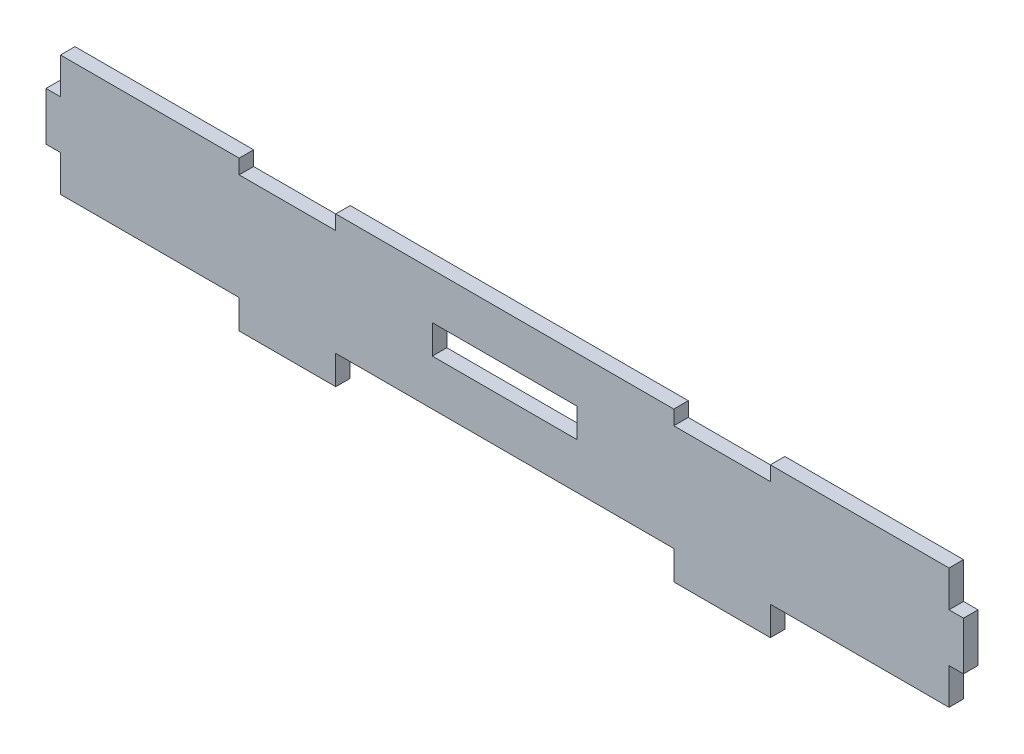
ISO-10303-21;
HEADER;
FILE_DESCRIPTION(('STEP AP214'),'2;1');
FILE_NAME('part.step','',(''),(''),'','','');
FILE_SCHEMA(('AUTOMOTIVE_DESIGN { 1 0 10303 214 1 1 1 1 }'));
ENDSEC;
DATA;
#1=APPLICATION_CONTEXT('core data for automotive mechanical design processes');
#2=APPLICATION_PROTOCOL_DEFINITION('international standard','automotive_design',2000,#1);
#3=PRODUCT_CONTEXT('',#1,'mechanical');
#4=PRODUCT('Part','Part','',(#3));
#5=PRODUCT_RELATED_PRODUCT_CATEGORY('part','',(#4));
#6=PRODUCT_DEFINITION_FORMATION('','',#4);
#7=PRODUCT_DEFINITION_CONTEXT('part definition',#1,'design');
#8=PRODUCT_DEFINITION('design','',#6,#7);
#9=PRODUCT_DEFINITION_SHAPE('','',#8);
#10=(LENGTH_UNIT() NAMED_UNIT(*) SI_UNIT(.MILLI.,.METRE.));
#11=(NAMED_UNIT(*) PLANE_ANGLE_UNIT() SI_UNIT($,.RADIAN.));
#12=(NAMED_UNIT(*) SI_UNIT($,.STERADIAN.) SOLID_ANGLE_UNIT());
#13=UNCERTAINTY_MEASURE_WITH_UNIT(LENGTH_MEASURE(1.E-05),#10,'distance_accuracy_value','');
#14=(GEOMETRIC_REPRESENTATION_CONTEXT(3) GLOBAL_UNCERTAINTY_ASSIGNED_CONTEXT((#13)) GLOBAL_UNIT_ASSIGNED_CONTEXT((#10,
#11,#12)) REPRESENTATION_CONTEXT('',''));
#15=CARTESIAN_POINT('',(0.,0.,0.));
#16=DIRECTION('',(0.,0.,1.));
#17=DIRECTION('',(1.,0.,0.));
#18=AXIS2_PLACEMENT_3D('',#15,#16,#17);
#19=CARTESIAN_POINT('',(0.,0.,3.));
#20=DIRECTION('',(0.,0.,-1.));
#21=DIRECTION('',(-1.,0.,0.));
#22=AXIS2_PLACEMENT_3D('',#19,#20,#21);
#23=PLANE('',#22);
#24=DIRECTION('',(0.,-1.,0.));
#25=VECTOR('',#24,1.);
#26=CARTESIAN_POINT('',(0.,0.,3.));
#27=LINE('',#26,#25);
#28=CARTESIAN_POINT('',(0.,7.5,3.));
#29=VERTEX_POINT('',#28);
#30=CARTESIAN_POINT('',(0.,0.,3.));
#31=VERTEX_POINT('',#30);
#32=EDGE_CURVE('E297',#29,#31,#27,.T.);
#33=ORIENTED_EDGE('',*,*,#32,.T.);
#34=DIRECTION('',(1.,0.,0.));
#35=VECTOR('',#34,1.);
#36=CARTESIAN_POINT('',(0.,0.,3.));
#37=LINE('',#36,#35);
#38=CARTESIAN_POINT('',(37.,0.,3.));
#39=VERTEX_POINT('',#38);
#40=EDGE_CURVE('E301',#31,#39,#37,.T.);
#41=ORIENTED_EDGE('',*,*,#40,.T.);
#42=DIRECTION('',(0.,-1.,0.));
#43=VECTOR('',#42,1.);
#44=CARTESIAN_POINT('',(37.,0.,3.));
#45=LINE('',#44,#43);
#46=CARTESIAN_POINT('',(37.,-6.,3.));
#47=VERTEX_POINT('',#46);
#48=EDGE_CURVE('E305',#39,#47,#45,.T.);
#49=ORIENTED_EDGE('',*,*,#48,.T.);
#50=DIRECTION('',(1.,0.,0.));
#51=VECTOR('',#50,1.);
#52=CARTESIAN_POINT('',(37.,-6.,3.));
#53=LINE('',#52,#51);
#54=CARTESIAN_POINT('',(57.,-6.,3.));
#55=VERTEX_POINT('',#54);
#56=EDGE_CURVE('E308',#47,#55,#53,.T.);
#57=ORIENTED_EDGE('',*,*,#56,.T.);
#58=DIRECTION('',(0.,1.,0.));
#59=VECTOR('',#58,1.);
#60=CARTESIAN_POINT('',(57.,0.,3.));
#61=LINE('',#60,#59);
#62=CARTESIAN_POINT('',(57.,0.,3.));
#63=VERTEX_POINT('',#62);
#64=EDGE_CURVE('E311',#55,#63,#61,.T.);
#65=ORIENTED_EDGE('',*,*,#64,.T.);
#66=DIRECTION('',(1.,0.,0.));
#67=VECTOR('',#66,1.);
#68=CARTESIAN_POINT('',(57.,0.,3.));
#69=LINE('',#68,#67);
#70=CARTESIAN_POINT('',(127.,0.,3.));
#71=VERTEX_POINT('',#70);
#72=EDGE_CURVE('E314',#63,#71,#69,.T.);
#73=ORIENTED_EDGE('',*,*,#72,.T.);
#74=DIRECTION('',(0.,-1.,0.));
#75=VECTOR('',#74,1.);
#76=CARTESIAN_POINT('',(127.,0.,3.));
#77=LINE('',#76,#75);
#78=CARTESIAN_POINT('',(127.,-6.,3.));
#79=VERTEX_POINT('',#78);
#80=EDGE_CURVE('E317',#71,#79,#77,.T.);
#81=ORIENTED_EDGE('',*,*,#80,.T.);
#82=DIRECTION('',(1.,0.,0.));
#83=VECTOR('',#82,1.);
#84=CARTESIAN_POINT('',(127.,-6.,3.));
#85=LINE('',#84,#83);
#86=CARTESIAN_POINT('',(147.,-6.,3.));
#87=VERTEX_POINT('',#86);
#88=EDGE_CURVE('E320',#79,#87,#85,.T.);
#89=ORIENTED_EDGE('',*,*,#88,.T.);
#90=DIRECTION('',(0.,1.,0.));
#91=VECTOR('',#90,1.);
#92=CARTESIAN_POINT('',(147.,0.,3.));
#93=LINE('',#92,#91);
#94=CARTESIAN_POINT('',(147.,0.,3.));
#95=VERTEX_POINT('',#94);
#96=EDGE_CURVE('E323',#87,#95,#93,.T.);
#97=ORIENTED_EDGE('',*,*,#96,.T.);
#98=DIRECTION('',(1.,0.,0.));
#99=VECTOR('',#98,1.);
#100=CARTESIAN_POINT('',(147.,0.,3.));
#101=LINE('',#100,#99);
#102=CARTESIAN_POINT('',(184.,0.,3.));
#103=VERTEX_POINT('',#102);
#104=EDGE_CURVE('E326',#95,#103,#101,.T.);
#105=ORIENTED_EDGE('',*,*,#104,.T.);
#106=DIRECTION('',(0.,1.,0.));
#107=VECTOR('',#106,1.);
#108=CARTESIAN_POINT('',(184.,0.,3.));
#109=LINE('',#108,#107);
#110=CARTESIAN_POINT('',(184.,7.5,3.));
#111=VERTEX_POINT('',#110);
#112=EDGE_CURVE('E329',#103,#111,#109,.T.);
#113=ORIENTED_EDGE('',*,*,#112,.T.);
#114=DIRECTION('',(1.,0.,0.));
#115=VECTOR('',#114,1.);
#116=CARTESIAN_POINT('',(184.,7.5,3.));
#117=LINE('',#116,#115);
#118=CARTESIAN_POINT('',(187.,7.5,3.));
#119=VERTEX_POINT('',#118);
#120=EDGE_CURVE('E332',#111,#119,#117,.T.);
#121=ORIENTED_EDGE('',*,*,#120,.T.);
#122=DIRECTION('',(0.,1.,0.));
#123=VECTOR('',#122,1.);
#124=CARTESIAN_POINT('',(187.,17.5,3.));
#125=LINE('',#124,#123);
#126=CARTESIAN_POINT('',(187.,17.5,3.));
#127=VERTEX_POINT('',#126);
#128=EDGE_CURVE('E335',#119,#127,#125,.T.);
#129=ORIENTED_EDGE('',*,*,#128,.T.);
#130=DIRECTION('',(-1.,0.,0.));
#131=VECTOR('',#130,1.);
#132=CARTESIAN_POINT('',(184.,17.5,3.));
#133=LINE('',#132,#131);
#134=CARTESIAN_POINT('',(184.,17.5,3.));
#135=VERTEX_POINT('',#134);
#136=EDGE_CURVE('E338',#127,#135,#133,.T.);
#137=ORIENTED_EDGE('',*,*,#136,.T.);
#138=DIRECTION('',(0.,1.,0.));
#139=VECTOR('',#138,1.);
#140=CARTESIAN_POINT('',(184.,17.5,3.));
#141=LINE('',#140,#139);
#142=CARTESIAN_POINT('',(184.,25.,3.));
#143=VERTEX_POINT('',#142);
#144=EDGE_CURVE('E341',#135,#143,#141,.T.);
#145=ORIENTED_EDGE('',*,*,#144,.T.);
#146=DIRECTION('',(-1.,0.,0.));
#147=VECTOR('',#146,1.);
#148=CARTESIAN_POINT('',(147.,25.,3.));
#149=LINE('',#148,#147);
#150=CARTESIAN_POINT('',(147.,25.,3.));
#151=VERTEX_POINT('',#150);
#152=EDGE_CURVE('E344',#143,#151,#149,.T.);
#153=ORIENTED_EDGE('',*,*,#152,.T.);
#154=DIRECTION('',(0.,-1.,0.));
#155=VECTOR('',#154,1.);
#156=CARTESIAN_POINT('',(147.,25.,3.));
#157=LINE('',#156,#155);
#158=CARTESIAN_POINT('',(147.,22.,3.));
#159=VERTEX_POINT('',#158);
#160=EDGE_CURVE('E347',#151,#159,#157,.T.);
#161=ORIENTED_EDGE('',*,*,#160,.T.);
#162=DIRECTION('',(-1.,0.,0.));
#163=VECTOR('',#162,1.);
#164=CARTESIAN_POINT('',(127.,22.,3.));
#165=LINE('',#164,#163);
#166=CARTESIAN_POINT('',(127.,22.,3.));
#167=VERTEX_POINT('',#166);
#168=EDGE_CURVE('E350',#159,#167,#165,.T.);
#169=ORIENTED_EDGE('',*,*,#168,.T.);
#170=DIRECTION('',(0.,1.,0.));
#171=VECTOR('',#170,1.);
#172=CARTESIAN_POINT('',(127.,25.,3.));
#173=LINE('',#172,#171);
#174=CARTESIAN_POINT('',(127.,25.,3.));
#175=VERTEX_POINT('',#174);
#176=EDGE_CURVE('E353',#167,#175,#173,.T.);
#177=ORIENTED_EDGE('',*,*,#176,.T.);
#178=DIRECTION('',(-1.,0.,0.));
#179=VECTOR('',#178,1.);
#180=CARTESIAN_POINT('',(57.,25.,3.));
#181=LINE('',#180,#179);
#182=CARTESIAN_POINT('',(57.,25.,3.));
#183=VERTEX_POINT('',#182);
#184=EDGE_CURVE('E356',#175,#183,#181,.T.);
#185=ORIENTED_EDGE('',*,*,#184,.T.);
#186=DIRECTION('',(0.,-1.,0.));
#187=VECTOR('',#186,1.);
#188=CARTESIAN_POINT('',(57.,25.,3.));
#189=LINE('',#188,#187);
#190=CARTESIAN_POINT('',(57.,22.,3.));
#191=VERTEX_POINT('',#190);
#192=EDGE_CURVE('E359',#183,#191,#189,.T.);
#193=ORIENTED_EDGE('',*,*,#192,.T.);
#194=DIRECTION('',(-1.,0.,0.));
#195=VECTOR('',#194,1.);
#196=CARTESIAN_POINT('',(37.,22.,3.));
#197=LINE('',#196,#195);
#198=CARTESIAN_POINT('',(37.,22.,3.));
#199=VERTEX_POINT('',#198);
#200=EDGE_CURVE('E362',#191,#199,#197,.T.);
#201=ORIENTED_EDGE('',*,*,#200,.T.);
#202=DIRECTION('',(0.,1.,0.));
#203=VECTOR('',#202,1.);
#204=CARTESIAN_POINT('',(37.,25.,3.));
#205=LINE('',#204,#203);
#206=CARTESIAN_POINT('',(37.,25.,3.));
#207=VERTEX_POINT('',#206);
#208=EDGE_CURVE('E365',#199,#207,#205,.T.);
#209=ORIENTED_EDGE('',*,*,#208,.T.);
#210=DIRECTION('',(-1.,0.,0.));
#211=VECTOR('',#210,1.);
#212=CARTESIAN_POINT('',(0.,25.,3.));
#213=LINE('',#212,#211);
#214=CARTESIAN_POINT('',(0.,25.,3.));
#215=VERTEX_POINT('',#214);
#216=EDGE_CURVE('E368',#207,#215,#213,.T.);
#217=ORIENTED_EDGE('',*,*,#216,.T.);
#218=DIRECTION('',(0.,-1.,0.));
#219=VECTOR('',#218,1.);
#220=CARTESIAN_POINT('',(0.,17.5,3.));
#221=LINE('',#220,#219);
#222=CARTESIAN_POINT('',(0.,17.5,3.));
#223=VERTEX_POINT('',#222);
#224=EDGE_CURVE('E371',#215,#223,#221,.T.);
#225=ORIENTED_EDGE('',*,*,#224,.T.);
#226=DIRECTION('',(-1.,0.,0.));
#227=VECTOR('',#226,1.);
#228=CARTESIAN_POINT('',(-3.,17.5,3.));
#229=LINE('',#228,#227);
#230=CARTESIAN_POINT('',(-3.,17.5,3.));
#231=VERTEX_POINT('',#230);
#232=EDGE_CURVE('E374',#223,#231,#229,.T.);
#233=ORIENTED_EDGE('',*,*,#232,.T.);
#234=DIRECTION('',(0.,-1.,0.));
#235=VECTOR('',#234,1.);
#236=CARTESIAN_POINT('',(-3.,17.5,3.));
#237=LINE('',#236,#235);
#238=CARTESIAN_POINT('',(-3.,7.5,3.));
#239=VERTEX_POINT('',#238);
#240=EDGE_CURVE('E377',#231,#239,#237,.T.);
#241=ORIENTED_EDGE('',*,*,#240,.T.);
#242=DIRECTION('',(1.,0.,0.));
#243=VECTOR('',#242,1.);
#244=CARTESIAN_POINT('',(-3.,7.5,3.));
#245=LINE('',#244,#243);
#246=EDGE_CURVE('E380',#239,#29,#245,.T.);
#247=ORIENTED_EDGE('',*,*,#246,.T.);
#248=EDGE_LOOP('',(#33,#41,#49,#57,#65,#73,#81,#89,#97,#105,#113,#121,#129,#137,#145,#153,#161,
#169,#177,#185,#193,#201,#209,#217,#225,#233,#241,#247));
#249=FACE_BOUND('',#248,.T.);
#250=DIRECTION('',(0.,-1.,0.));
#251=VECTOR('',#250,1.);
#252=CARTESIAN_POINT('',(77.,15.5,3.));
#253=LINE('',#252,#251);
#254=CARTESIAN_POINT('',(77.,15.5,3.));
#255=VERTEX_POINT('',#254);
#256=CARTESIAN_POINT('',(77.,9.5,3.));
#257=VERTEX_POINT('',#256);
#258=EDGE_CURVE('E249',#255,#257,#253,.T.);
#259=ORIENTED_EDGE('',*,*,#258,.F.);
#260=DIRECTION('',(-1.,0.,0.));
#261=VECTOR('',#260,1.);
#262=CARTESIAN_POINT('',(77.,15.5,3.));
#263=LINE('',#262,#261);
#264=CARTESIAN_POINT('',(107.,15.5,3.));
#265=VERTEX_POINT('',#264);
#266=EDGE_CURVE('E275',#265,#255,#263,.T.);
#267=ORIENTED_EDGE('',*,*,#266,.F.);
#268=DIRECTION('',(0.,1.,0.));
#269=VECTOR('',#268,1.);
#270=CARTESIAN_POINT('',(107.,15.5,3.));
#271=LINE('',#270,#269);
#272=CARTESIAN_POINT('',(107.,9.5,3.));
#273=VERTEX_POINT('',#272);
#274=EDGE_CURVE('E271',#273,#265,#271,.T.);
#275=ORIENTED_EDGE('',*,*,#274,.F.);
#276=DIRECTION('',(1.,0.,0.));
#277=VECTOR('',#276,1.);
#278=CARTESIAN_POINT('',(77.,9.5,3.));
#279=LINE('',#278,#277);
#280=EDGE_CURVE('E258',#257,#273,#279,.T.);
#281=ORIENTED_EDGE('',*,*,#280,.F.);
#282=EDGE_LOOP('',(#259,#267,#275,#281));
#283=FACE_BOUND('',#282,.T.);
#284=ADVANCED_FACE('F39',(#249,#283),#23,.F.);
#285=CARTESIAN_POINT('',(0.,0.,0.));
#286=DIRECTION('',(0.,0.,-1.));
#287=DIRECTION('',(-1.,0.,0.));
#288=AXIS2_PLACEMENT_3D('',#285,#286,#287);
#289=PLANE('',#288);
#290=DIRECTION('',(0.,-1.,0.));
#291=VECTOR('',#290,1.);
#292=CARTESIAN_POINT('',(0.,0.,0.));
#293=LINE('',#292,#291);
#294=CARTESIAN_POINT('',(0.,7.5,0.));
#295=VERTEX_POINT('',#294);
#296=CARTESIAN_POINT('',(0.,0.,0.));
#297=VERTEX_POINT('',#296);
#298=EDGE_CURVE('E267',#295,#297,#293,.T.);
#299=ORIENTED_EDGE('',*,*,#298,.F.);
#300=DIRECTION('',(1.,0.,0.));
#301=VECTOR('',#300,1.);
#302=CARTESIAN_POINT('',(-3.,7.5,0.));
#303=LINE('',#302,#301);
#304=CARTESIAN_POINT('',(-3.,7.5,0.));
#305=VERTEX_POINT('',#304);
#306=EDGE_CURVE('E302',#305,#295,#303,.T.);
#307=ORIENTED_EDGE('',*,*,#306,.F.);
#308=DIRECTION('',(0.,-1.,0.));
#309=VECTOR('',#308,1.);
#310=CARTESIAN_POINT('',(-3.,17.5,0.));
#311=LINE('',#310,#309);
#312=CARTESIAN_POINT('',(-3.,17.5,0.));
#313=VERTEX_POINT('',#312);
#314=EDGE_CURVE('E462',#313,#305,#311,.T.);
#315=ORIENTED_EDGE('',*,*,#314,.F.);
#316=DIRECTION('',(-1.,0.,0.));
#317=VECTOR('',#316,1.);
#318=CARTESIAN_POINT('',(-3.,17.5,0.));
#319=LINE('',#318,#317);
#320=CARTESIAN_POINT('',(0.,17.5,0.));
#321=VERTEX_POINT('',#320);
#322=EDGE_CURVE('E459',#321,#313,#319,.T.);
#323=ORIENTED_EDGE('',*,*,#322,.F.);
#324=DIRECTION('',(0.,-1.,0.));
#325=VECTOR('',#324,1.);
#326=CARTESIAN_POINT('',(0.,17.5,0.));
#327=LINE('',#326,#325);
#328=CARTESIAN_POINT('',(0.,25.,0.));
#329=VERTEX_POINT('',#328);
#330=EDGE_CURVE('E456',#329,#321,#327,.T.);
#331=ORIENTED_EDGE('',*,*,#330,.F.);
#332=DIRECTION('',(-1.,0.,0.));
#333=VECTOR('',#332,1.);
#334=CARTESIAN_POINT('',(0.,25.,0.));
#335=LINE('',#334,#333);
#336=CARTESIAN_POINT('',(37.,25.,0.));
#337=VERTEX_POINT('',#336);
#338=EDGE_CURVE('E453',#337,#329,#335,.T.);
#339=ORIENTED_EDGE('',*,*,#338,.F.);
#340=DIRECTION('',(0.,1.,0.));
#341=VECTOR('',#340,1.);
#342=CARTESIAN_POINT('',(37.,25.,0.));
#343=LINE('',#342,#341);
#344=CARTESIAN_POINT('',(37.,22.,0.));
#345=VERTEX_POINT('',#344);
#346=EDGE_CURVE('E450',#345,#337,#343,.T.);
#347=ORIENTED_EDGE('',*,*,#346,.F.);
#348=DIRECTION('',(-1.,0.,0.));
#349=VECTOR('',#348,1.);
#350=CARTESIAN_POINT('',(37.,22.,0.));
#351=LINE('',#350,#349);
#352=CARTESIAN_POINT('',(57.,22.,0.));
#353=VERTEX_POINT('',#352);
#354=EDGE_CURVE('E447',#353,#345,#351,.T.);
#355=ORIENTED_EDGE('',*,*,#354,.F.);
#356=DIRECTION('',(0.,-1.,0.));
#357=VECTOR('',#356,1.);
#358=CARTESIAN_POINT('',(57.,25.,0.));
#359=LINE('',#358,#357);
#360=CARTESIAN_POINT('',(57.,25.,0.));
#361=VERTEX_POINT('',#360);
#362=EDGE_CURVE('E444',#361,#353,#359,.T.);
#363=ORIENTED_EDGE('',*,*,#362,.F.);
#364=DIRECTION('',(-1.,0.,0.));
#365=VECTOR('',#364,1.);
#366=CARTESIAN_POINT('',(57.,25.,0.));
#367=LINE('',#366,#365);
#368=CARTESIAN_POINT('',(127.,25.,0.));
#369=VERTEX_POINT('',#368);
#370=EDGE_CURVE('E441',#369,#361,#367,.T.);
#371=ORIENTED_EDGE('',*,*,#370,.F.);
#372=DIRECTION('',(0.,1.,0.));
#373=VECTOR('',#372,1.);
#374=CARTESIAN_POINT('',(127.,25.,0.));
#375=LINE('',#374,#373);
#376=CARTESIAN_POINT('',(127.,22.,0.));
#377=VERTEX_POINT('',#376);
#378=EDGE_CURVE('E438',#377,#369,#375,.T.);
#379=ORIENTED_EDGE('',*,*,#378,.F.);
#380=DIRECTION('',(-1.,0.,0.));
#381=VECTOR('',#380,1.);
#382=CARTESIAN_POINT('',(127.,22.,0.));
#383=LINE('',#382,#381);
#384=CARTESIAN_POINT('',(147.,22.,0.));
#385=VERTEX_POINT('',#384);
#386=EDGE_CURVE('E435',#385,#377,#383,.T.);
#387=ORIENTED_EDGE('',*,*,#386,.F.);
#388=DIRECTION('',(0.,-1.,0.));
#389=VECTOR('',#388,1.);
#390=CARTESIAN_POINT('',(147.,25.,0.));
#391=LINE('',#390,#389);
#392=CARTESIAN_POINT('',(147.,25.,0.));
#393=VERTEX_POINT('',#392);
#394=EDGE_CURVE('E432',#393,#385,#391,.T.);
#395=ORIENTED_EDGE('',*,*,#394,.F.);
#396=DIRECTION('',(-1.,0.,0.));
#397=VECTOR('',#396,1.);
#398=CARTESIAN_POINT('',(147.,25.,0.));
#399=LINE('',#398,#397);
#400=CARTESIAN_POINT('',(184.,25.,0.));
#401=VERTEX_POINT('',#400);
#402=EDGE_CURVE('E429',#401,#393,#399,.T.);
#403=ORIENTED_EDGE('',*,*,#402,.F.);
#404=DIRECTION('',(0.,1.,0.));
#405=VECTOR('',#404,1.);
#406=CARTESIAN_POINT('',(184.,17.5,0.));
#407=LINE('',#406,#405);
#408=CARTESIAN_POINT('',(184.,17.5,0.));
#409=VERTEX_POINT('',#408);
#410=EDGE_CURVE('E426',#409,#401,#407,.T.);
#411=ORIENTED_EDGE('',*,*,#410,.F.);
#412=DIRECTION('',(-1.,0.,0.));
#413=VECTOR('',#412,1.);
#414=CARTESIAN_POINT('',(184.,17.5,0.));
#415=LINE('',#414,#413);
#416=CARTESIAN_POINT('',(187.,17.5,0.));
#417=VERTEX_POINT('',#416);
#418=EDGE_CURVE('E423',#417,#409,#415,.T.);
#419=ORIENTED_EDGE('',*,*,#418,.F.);
#420=DIRECTION('',(0.,1.,0.));
#421=VECTOR('',#420,1.);
#422=CARTESIAN_POINT('',(187.,17.5,0.));
#423=LINE('',#422,#421);
#424=CARTESIAN_POINT('',(187.,7.5,0.));
#425=VERTEX_POINT('',#424);
#426=EDGE_CURVE('E420',#425,#417,#423,.T.);
#427=ORIENTED_EDGE('',*,*,#426,.F.);
#428=DIRECTION('',(1.,0.,0.));
#429=VECTOR('',#428,1.);
#430=CARTESIAN_POINT('',(184.,7.5,0.));
#431=LINE('',#430,#429);
#432=CARTESIAN_POINT('',(184.,7.5,0.));
#433=VERTEX_POINT('',#432);
#434=EDGE_CURVE('E417',#433,#425,#431,.T.);
#435=ORIENTED_EDGE('',*,*,#434,.F.);
#436=DIRECTION('',(0.,1.,0.));
#437=VECTOR('',#436,1.);
#438=CARTESIAN_POINT('',(184.,0.,0.));
#439=LINE('',#438,#437);
#440=CARTESIAN_POINT('',(184.,0.,0.));
#441=VERTEX_POINT('',#440);
#442=EDGE_CURVE('E414',#441,#433,#439,.T.);
#443=ORIENTED_EDGE('',*,*,#442,.F.);
#444=DIRECTION('',(1.,0.,0.));
#445=VECTOR('',#444,1.);
#446=CARTESIAN_POINT('',(147.,0.,0.));
#447=LINE('',#446,#445);
#448=CARTESIAN_POINT('',(147.,0.,0.));
#449=VERTEX_POINT('',#448);
#450=EDGE_CURVE('E411',#449,#441,#447,.T.);
#451=ORIENTED_EDGE('',*,*,#450,.F.);
#452=DIRECTION('',(0.,1.,0.));
#453=VECTOR('',#452,1.);
#454=CARTESIAN_POINT('',(147.,0.,0.));
#455=LINE('',#454,#453);
#456=CARTESIAN_POINT('',(147.,-6.,0.));
#457=VERTEX_POINT('',#456);
#458=EDGE_CURVE('E408',#457,#449,#455,.T.);
#459=ORIENTED_EDGE('',*,*,#458,.F.);
#460=DIRECTION('',(1.,0.,0.));
#461=VECTOR('',#460,1.);
#462=CARTESIAN_POINT('',(127.,-6.,0.));
#463=LINE('',#462,#461);
#464=CARTESIAN_POINT('',(127.,-6.,0.));
#465=VERTEX_POINT('',#464);
#466=EDGE_CURVE('E405',#465,#457,#463,.T.);
#467=ORIENTED_EDGE('',*,*,#466,.F.);
#468=DIRECTION('',(0.,-1.,0.));
#469=VECTOR('',#468,1.);
#470=CARTESIAN_POINT('',(127.,0.,0.));
#471=LINE('',#470,#469);
#472=CARTESIAN_POINT('',(127.,0.,0.));
#473=VERTEX_POINT('',#472);
#474=EDGE_CURVE('E402',#473,#465,#471,.T.);
#475=ORIENTED_EDGE('',*,*,#474,.F.);
#476=DIRECTION('',(1.,0.,0.));
#477=VECTOR('',#476,1.);
#478=CARTESIAN_POINT('',(57.,0.,0.));
#479=LINE('',#478,#477);
#480=CARTESIAN_POINT('',(57.,0.,0.));
#481=VERTEX_POINT('',#480);
#482=EDGE_CURVE('E399',#481,#473,#479,.T.);
#483=ORIENTED_EDGE('',*,*,#482,.F.);
#484=DIRECTION('',(0.,1.,0.));
#485=VECTOR('',#484,1.);
#486=CARTESIAN_POINT('',(57.,0.,0.));
#487=LINE('',#486,#485);
#488=CARTESIAN_POINT('',(57.,-6.,0.));
#489=VERTEX_POINT('',#488);
#490=EDGE_CURVE('E396',#489,#481,#487,.T.);
#491=ORIENTED_EDGE('',*,*,#490,.F.);
#492=DIRECTION('',(1.,0.,0.));
#493=VECTOR('',#492,1.);
#494=CARTESIAN_POINT('',(37.,-6.,0.));
#495=LINE('',#494,#493);
#496=CARTESIAN_POINT('',(37.,-6.,0.));
#497=VERTEX_POINT('',#496);
#498=EDGE_CURVE('E393',#497,#489,#495,.T.);
#499=ORIENTED_EDGE('',*,*,#498,.F.);
#500=DIRECTION('',(0.,-1.,0.));
#501=VECTOR('',#500,1.);
#502=CARTESIAN_POINT('',(37.,0.,0.));
#503=LINE('',#502,#501);
#504=CARTESIAN_POINT('',(37.,0.,0.));
#505=VERTEX_POINT('',#504);
#506=EDGE_CURVE('E390',#505,#497,#503,.T.);
#507=ORIENTED_EDGE('',*,*,#506,.F.);
#508=DIRECTION('',(1.,0.,0.));
#509=VECTOR('',#508,1.);
#510=CARTESIAN_POINT('',(0.,0.,0.));
#511=LINE('',#510,#509);
#512=EDGE_CURVE('E387',#297,#505,#511,.T.);
#513=ORIENTED_EDGE('',*,*,#512,.F.);
#514=EDGE_LOOP('',(#299,#307,#315,#323,#331,#339,#347,#355,#363,#371,#379,#387,#395,#403,#411,
#419,#427,#435,#443,#451,#459,#467,#475,#483,#491,#499,#507,#513));
#515=FACE_BOUND('',#514,.T.);
#516=DIRECTION('',(-1.,0.,0.));
#517=VECTOR('',#516,1.);
#518=CARTESIAN_POINT('',(77.,15.5,0.));
#519=LINE('',#518,#517);
#520=CARTESIAN_POINT('',(107.,15.5,0.));
#521=VERTEX_POINT('',#520);
#522=CARTESIAN_POINT('',(77.,15.5,0.));
#523=VERTEX_POINT('',#522);
#524=EDGE_CURVE('E259',#521,#523,#519,.T.);
#525=ORIENTED_EDGE('',*,*,#524,.T.);
#526=DIRECTION('',(0.,-1.,0.));
#527=VECTOR('',#526,1.);
#528=CARTESIAN_POINT('',(77.,15.5,0.));
#529=LINE('',#528,#527);
#530=CARTESIAN_POINT('',(77.,9.5,0.));
#531=VERTEX_POINT('',#530);
#532=EDGE_CURVE('E63',#523,#531,#529,.T.);
#533=ORIENTED_EDGE('',*,*,#532,.T.);
#534=DIRECTION('',(1.,0.,0.));
#535=VECTOR('',#534,1.);
#536=CARTESIAN_POINT('',(77.,9.5,0.));
#537=LINE('',#536,#535);
#538=CARTESIAN_POINT('',(107.,9.5,0.));
#539=VERTEX_POINT('',#538);
#540=EDGE_CURVE('E265',#531,#539,#537,.T.);
#541=ORIENTED_EDGE('',*,*,#540,.T.);
#542=DIRECTION('',(0.,1.,0.));
#543=VECTOR('',#542,1.);
#544=CARTESIAN_POINT('',(107.,15.5,0.));
#545=LINE('',#544,#543);
#546=EDGE_CURVE('E284',#539,#521,#545,.T.);
#547=ORIENTED_EDGE('',*,*,#546,.T.);
#548=EDGE_LOOP('',(#525,#533,#541,#547));
#549=FACE_BOUND('',#548,.T.);
#550=ADVANCED_FACE('F581',(#515,#549),#289,.T.);
#551=CARTESIAN_POINT('',(0.,0.,3.));
#552=DIRECTION('',(1.,0.,0.));
#553=DIRECTION('',(0.,0.,-1.));
#554=AXIS2_PLACEMENT_3D('',#551,#552,#553);
#555=PLANE('',#554);
#556=ORIENTED_EDGE('',*,*,#298,.T.);
#557=DIRECTION('',(0.,0.,-1.));
#558=VECTOR('',#557,1.);
#559=CARTESIAN_POINT('',(0.,0.,3.));
#560=LINE('',#559,#558);
#561=EDGE_CURVE('E11',#31,#297,#560,.T.);
#562=ORIENTED_EDGE('',*,*,#561,.F.);
#563=ORIENTED_EDGE('',*,*,#32,.F.);
#564=DIRECTION('',(0.,0.,-1.));
#565=VECTOR('',#564,1.);
#566=CARTESIAN_POINT('',(0.,7.5,3.));
#567=LINE('',#566,#565);
#568=EDGE_CURVE('E383',#29,#295,#567,.T.);
#569=ORIENTED_EDGE('',*,*,#568,.T.);
#570=EDGE_LOOP('',(#556,#562,#563,#569));
#571=FACE_BOUND('',#570,.T.);
#572=ADVANCED_FACE('F41',(#571),#555,.F.);
#573=CARTESIAN_POINT('',(0.,0.,3.));
#574=DIRECTION('',(0.,1.,0.));
#575=DIRECTION('',(0.,0.,1.));
#576=AXIS2_PLACEMENT_3D('',#573,#574,#575);
#577=PLANE('',#576);
#578=ORIENTED_EDGE('',*,*,#512,.T.);
#579=DIRECTION('',(0.,0.,-1.));
#580=VECTOR('',#579,1.);
#581=CARTESIAN_POINT('',(37.,0.,3.));
#582=LINE('',#581,#580);
#583=EDGE_CURVE('E48',#39,#505,#582,.T.);
#584=ORIENTED_EDGE('',*,*,#583,.F.);
#585=ORIENTED_EDGE('',*,*,#40,.F.);
#586=ORIENTED_EDGE('',*,*,#561,.T.);
#587=EDGE_LOOP('',(#578,#584,#585,#586));
#588=FACE_BOUND('',#587,.T.);
#589=ADVANCED_FACE('F598',(#588),#577,.F.);
#590=CARTESIAN_POINT('',(37.,0.,3.));
#591=DIRECTION('',(1.,0.,0.));
#592=DIRECTION('',(0.,1.,0.));
#593=AXIS2_PLACEMENT_3D('',#590,#591,#592);
#594=PLANE('',#593);
#595=ORIENTED_EDGE('',*,*,#506,.T.);
#596=DIRECTION('',(0.,0.,-1.));
#597=VECTOR('',#596,1.);
#598=CARTESIAN_POINT('',(37.,-6.,3.));
#599=LINE('',#598,#597);
#600=EDGE_CURVE('E566',#47,#497,#599,.T.);
#601=ORIENTED_EDGE('',*,*,#600,.F.);
#602=ORIENTED_EDGE('',*,*,#48,.F.);
#603=ORIENTED_EDGE('',*,*,#583,.T.);
#604=EDGE_LOOP('',(#595,#601,#602,#603));
#605=FACE_BOUND('',#604,.T.);
#606=ADVANCED_FACE('F575',(#605),#594,.F.);
#607=CARTESIAN_POINT('',(37.,-6.,3.));
#608=DIRECTION('',(0.,1.,0.));
#609=DIRECTION('',(-1.,0.,0.));
#610=AXIS2_PLACEMENT_3D('',#607,#608,#609);
#611=PLANE('',#610);
#612=ORIENTED_EDGE('',*,*,#498,.T.);
#613=DIRECTION('',(0.,0.,-1.));
#614=VECTOR('',#613,1.);
#615=CARTESIAN_POINT('',(57.,-6.,3.));
#616=LINE('',#615,#614);
#617=EDGE_CURVE('E562',#55,#489,#616,.T.);
#618=ORIENTED_EDGE('',*,*,#617,.F.);
#619=ORIENTED_EDGE('',*,*,#56,.F.);
#620=ORIENTED_EDGE('',*,*,#600,.T.);
#621=EDGE_LOOP('',(#612,#618,#619,#620));
#622=FACE_BOUND('',#621,.T.);
#623=ADVANCED_FACE('F587',(#622),#611,.F.);
#624=CARTESIAN_POINT('',(57.,0.,3.));
#625=DIRECTION('',(-1.,0.,0.));
#626=DIRECTION('',(0.,0.,1.));
#627=AXIS2_PLACEMENT_3D('',#624,#625,#626);
#628=PLANE('',#627);
#629=ORIENTED_EDGE('',*,*,#490,.T.);
#630=DIRECTION('',(0.,0.,-1.));
#631=VECTOR('',#630,1.);
#632=CARTESIAN_POINT('',(57.,0.,3.));
#633=LINE('',#632,#631);
#634=EDGE_CURVE('E558',#63,#481,#633,.T.);
#635=ORIENTED_EDGE('',*,*,#634,.F.);
#636=ORIENTED_EDGE('',*,*,#64,.F.);
#637=ORIENTED_EDGE('',*,*,#617,.T.);
#638=EDGE_LOOP('',(#629,#635,#636,#637));
#639=FACE_BOUND('',#638,.T.);
#640=ADVANCED_FACE('F591',(#639),#628,.F.);
#641=CARTESIAN_POINT('',(57.,0.,3.));
#642=DIRECTION('',(0.,1.,0.));
#643=DIRECTION('',(0.,0.,1.));
#644=AXIS2_PLACEMENT_3D('',#641,#642,#643);
#645=PLANE('',#644);
#646=ORIENTED_EDGE('',*,*,#482,.T.);
#647=DIRECTION('',(0.,0.,-1.));
#648=VECTOR('',#647,1.);
#649=CARTESIAN_POINT('',(127.,0.,3.));
#650=LINE('',#649,#648);
#651=EDGE_CURVE('E554',#71,#473,#650,.T.);
#652=ORIENTED_EDGE('',*,*,#651,.F.);
#653=ORIENTED_EDGE('',*,*,#72,.F.);
#654=ORIENTED_EDGE('',*,*,#634,.T.);
#655=EDGE_LOOP('',(#646,#652,#653,#654));
#656=FACE_BOUND('',#655,.T.);
#657=ADVANCED_FACE('F711',(#656),#645,.F.);
#658=CARTESIAN_POINT('',(127.,0.,3.));
#659=DIRECTION('',(1.,0.,0.));
#660=DIRECTION('',(0.,0.,-1.));
#661=AXIS2_PLACEMENT_3D('',#658,#659,#660);
#662=PLANE('',#661);
#663=ORIENTED_EDGE('',*,*,#474,.T.);
#664=DIRECTION('',(0.,0.,-1.));
#665=VECTOR('',#664,1.);
#666=CARTESIAN_POINT('',(127.,-6.,3.));
#667=LINE('',#666,#665);
#668=EDGE_CURVE('E550',#79,#465,#667,.T.);
#669=ORIENTED_EDGE('',*,*,#668,.F.);
#670=ORIENTED_EDGE('',*,*,#80,.F.);
#671=ORIENTED_EDGE('',*,*,#651,.T.);
#672=EDGE_LOOP('',(#663,#669,#670,#671));
#673=FACE_BOUND('',#672,.T.);
#674=ADVANCED_FACE('F708',(#673),#662,.F.);
#675=CARTESIAN_POINT('',(127.,-6.,3.));
#676=DIRECTION('',(0.,1.,0.));
#677=DIRECTION('',(0.,0.,1.));
#678=AXIS2_PLACEMENT_3D('',#675,#676,#677);
#679=PLANE('',#678);
#680=ORIENTED_EDGE('',*,*,#466,.T.);
#681=DIRECTION('',(0.,0.,-1.));
#682=VECTOR('',#681,1.);
#683=CARTESIAN_POINT('',(147.,-6.,3.));
#684=LINE('',#683,#682);
#685=EDGE_CURVE('E546',#87,#457,#684,.T.);
#686=ORIENTED_EDGE('',*,*,#685,.F.);
#687=ORIENTED_EDGE('',*,*,#88,.F.);
#688=ORIENTED_EDGE('',*,*,#668,.T.);
#689=EDGE_LOOP('',(#680,#686,#687,#688));
#690=FACE_BOUND('',#689,.T.);
#691=ADVANCED_FACE('F704',(#690),#679,.F.);
#692=CARTESIAN_POINT('',(147.,0.,3.));
#693=DIRECTION('',(-1.,0.,0.));
#694=DIRECTION('',(0.,0.,1.));
#695=AXIS2_PLACEMENT_3D('',#692,#693,#694);
#696=PLANE('',#695);
#697=ORIENTED_EDGE('',*,*,#458,.T.);
#698=DIRECTION('',(0.,0.,-1.));
#699=VECTOR('',#698,1.);
#700=CARTESIAN_POINT('',(147.,0.,3.));
#701=LINE('',#700,#699);
#702=EDGE_CURVE('E542',#95,#449,#701,.T.);
#703=ORIENTED_EDGE('',*,*,#702,.F.);
#704=ORIENTED_EDGE('',*,*,#96,.F.);
#705=ORIENTED_EDGE('',*,*,#685,.T.);
#706=EDGE_LOOP('',(#697,#703,#704,#705));
#707=FACE_BOUND('',#706,.T.);
#708=ADVANCED_FACE('F700',(#707),#696,.F.);
#709=CARTESIAN_POINT('',(147.,0.,3.));
#710=DIRECTION('',(0.,1.,0.));
#711=DIRECTION('',(0.,0.,1.));
#712=AXIS2_PLACEMENT_3D('',#709,#710,#711);
#713=PLANE('',#712);
#714=ORIENTED_EDGE('',*,*,#450,.T.);
#715=DIRECTION('',(0.,0.,-1.));
#716=VECTOR('',#715,1.);
#717=CARTESIAN_POINT('',(184.,0.,3.));
#718=LINE('',#717,#716);
#719=EDGE_CURVE('E538',#103,#441,#718,.T.);
#720=ORIENTED_EDGE('',*,*,#719,.F.);
#721=ORIENTED_EDGE('',*,*,#104,.F.);
#722=ORIENTED_EDGE('',*,*,#702,.T.);
#723=EDGE_LOOP('',(#714,#720,#721,#722));
#724=FACE_BOUND('',#723,.T.);
#725=ADVANCED_FACE('F695',(#724),#713,.F.);
#726=CARTESIAN_POINT('',(184.,0.,3.));
#727=DIRECTION('',(-1.,0.,0.));
#728=DIRECTION('',(0.,0.,1.));
#729=AXIS2_PLACEMENT_3D('',#726,#727,#728);
#730=PLANE('',#729);
#731=ORIENTED_EDGE('',*,*,#442,.T.);
#732=DIRECTION('',(0.,0.,-1.));
#733=VECTOR('',#732,1.);
#734=CARTESIAN_POINT('',(184.,7.5,3.));
#735=LINE('',#734,#733);
#736=EDGE_CURVE('E534',#111,#433,#735,.T.);
#737=ORIENTED_EDGE('',*,*,#736,.F.);
#738=ORIENTED_EDGE('',*,*,#112,.F.);
#739=ORIENTED_EDGE('',*,*,#719,.T.);
#740=EDGE_LOOP('',(#731,#737,#738,#739));
#741=FACE_BOUND('',#740,.T.);
#742=ADVANCED_FACE('F689',(#741),#730,.F.);
#743=CARTESIAN_POINT('',(184.,7.5,3.));
#744=DIRECTION('',(0.,1.,0.));
#745=DIRECTION('',(0.,0.,1.));
#746=AXIS2_PLACEMENT_3D('',#743,#744,#745);
#747=PLANE('',#746);
#748=ORIENTED_EDGE('',*,*,#434,.T.);
#749=DIRECTION('',(0.,0.,-1.));
#750=VECTOR('',#749,1.);
#751=CARTESIAN_POINT('',(187.,7.5,3.));
#752=LINE('',#751,#750);
#753=EDGE_CURVE('E530',#119,#425,#752,.T.);
#754=ORIENTED_EDGE('',*,*,#753,.F.);
#755=ORIENTED_EDGE('',*,*,#120,.F.);
#756=ORIENTED_EDGE('',*,*,#736,.T.);
#757=EDGE_LOOP('',(#748,#754,#755,#756));
#758=FACE_BOUND('',#757,.T.);
#759=ADVANCED_FACE('F685',(#758),#747,.F.);
#760=CARTESIAN_POINT('',(187.,17.5,3.));
#761=DIRECTION('',(-1.,0.,0.));
#762=DIRECTION('',(0.,0.,1.));
#763=AXIS2_PLACEMENT_3D('',#760,#761,#762);
#764=PLANE('',#763);
#765=ORIENTED_EDGE('',*,*,#426,.T.);
#766=DIRECTION('',(0.,0.,-1.));
#767=VECTOR('',#766,1.);
#768=CARTESIAN_POINT('',(187.,17.5,3.));
#769=LINE('',#768,#767);
#770=EDGE_CURVE('E526',#127,#417,#769,.T.);
#771=ORIENTED_EDGE('',*,*,#770,.F.);
#772=ORIENTED_EDGE('',*,*,#128,.F.);
#773=ORIENTED_EDGE('',*,*,#753,.T.);
#774=EDGE_LOOP('',(#765,#771,#772,#773));
#775=FACE_BOUND('',#774,.T.);
#776=ADVANCED_FACE('F680',(#775),#764,.F.);
#777=CARTESIAN_POINT('',(184.,17.5,3.));
#778=DIRECTION('',(0.,-1.,0.));
#779=DIRECTION('',(0.,0.,-1.));
#780=AXIS2_PLACEMENT_3D('',#777,#778,#779);
#781=PLANE('',#780);
#782=ORIENTED_EDGE('',*,*,#418,.T.);
#783=DIRECTION('',(0.,0.,-1.));
#784=VECTOR('',#783,1.);
#785=CARTESIAN_POINT('',(184.,17.5,3.));
#786=LINE('',#785,#784);
#787=EDGE_CURVE('E522',#135,#409,#786,.T.);
#788=ORIENTED_EDGE('',*,*,#787,.F.);
#789=ORIENTED_EDGE('',*,*,#136,.F.);
#790=ORIENTED_EDGE('',*,*,#770,.T.);
#791=EDGE_LOOP('',(#782,#788,#789,#790));
#792=FACE_BOUND('',#791,.T.);
#793=ADVANCED_FACE('F674',(#792),#781,.F.);
#794=CARTESIAN_POINT('',(184.,17.5,3.));
#795=DIRECTION('',(-1.,0.,0.));
#796=DIRECTION('',(0.,0.,1.));
#797=AXIS2_PLACEMENT_3D('',#794,#795,#796);
#798=PLANE('',#797);
#799=ORIENTED_EDGE('',*,*,#410,.T.);
#800=DIRECTION('',(0.,0.,-1.));
#801=VECTOR('',#800,1.);
#802=CARTESIAN_POINT('',(184.,25.,3.));
#803=LINE('',#802,#801);
#804=EDGE_CURVE('E518',#143,#401,#803,.T.);
#805=ORIENTED_EDGE('',*,*,#804,.F.);
#806=ORIENTED_EDGE('',*,*,#144,.F.);
#807=ORIENTED_EDGE('',*,*,#787,.T.);
#808=EDGE_LOOP('',(#799,#805,#806,#807));
#809=FACE_BOUND('',#808,.T.);
#810=ADVANCED_FACE('F670',(#809),#798,.F.);
#811=CARTESIAN_POINT('',(147.,25.,3.));
#812=DIRECTION('',(0.,-1.,0.));
#813=DIRECTION('',(0.,0.,-1.));
#814=AXIS2_PLACEMENT_3D('',#811,#812,#813);
#815=PLANE('',#814);
#816=ORIENTED_EDGE('',*,*,#402,.T.);
#817=DIRECTION('',(0.,0.,-1.));
#818=VECTOR('',#817,1.);
#819=CARTESIAN_POINT('',(147.,25.,3.));
#820=LINE('',#819,#818);
#821=EDGE_CURVE('E514',#151,#393,#820,.T.);
#822=ORIENTED_EDGE('',*,*,#821,.F.);
#823=ORIENTED_EDGE('',*,*,#152,.F.);
#824=ORIENTED_EDGE('',*,*,#804,.T.);
#825=EDGE_LOOP('',(#816,#822,#823,#824));
#826=FACE_BOUND('',#825,.T.);
#827=ADVANCED_FACE('F665',(#826),#815,.F.);
#828=CARTESIAN_POINT('',(147.,25.,3.));
#829=DIRECTION('',(1.,0.,0.));
#830=DIRECTION('',(0.,0.,-1.));
#831=AXIS2_PLACEMENT_3D('',#828,#829,#830);
#832=PLANE('',#831);
#833=ORIENTED_EDGE('',*,*,#394,.T.);
#834=DIRECTION('',(0.,0.,-1.));
#835=VECTOR('',#834,1.);
#836=CARTESIAN_POINT('',(147.,22.,3.));
#837=LINE('',#836,#835);
#838=EDGE_CURVE('E510',#159,#385,#837,.T.);
#839=ORIENTED_EDGE('',*,*,#838,.F.);
#840=ORIENTED_EDGE('',*,*,#160,.F.);
#841=ORIENTED_EDGE('',*,*,#821,.T.);
#842=EDGE_LOOP('',(#833,#839,#840,#841));
#843=FACE_BOUND('',#842,.T.);
#844=ADVANCED_FACE('F659',(#843),#832,.F.);
#845=CARTESIAN_POINT('',(127.,22.,3.));
#846=DIRECTION('',(0.,-1.,0.));
#847=DIRECTION('',(0.,0.,-1.));
#848=AXIS2_PLACEMENT_3D('',#845,#846,#847);
#849=PLANE('',#848);
#850=ORIENTED_EDGE('',*,*,#386,.T.);
#851=DIRECTION('',(0.,0.,-1.));
#852=VECTOR('',#851,1.);
#853=CARTESIAN_POINT('',(127.,22.,3.));
#854=LINE('',#853,#852);
#855=EDGE_CURVE('E506',#167,#377,#854,.T.);
#856=ORIENTED_EDGE('',*,*,#855,.F.);
#857=ORIENTED_EDGE('',*,*,#168,.F.);
#858=ORIENTED_EDGE('',*,*,#838,.T.);
#859=EDGE_LOOP('',(#850,#856,#857,#858));
#860=FACE_BOUND('',#859,.T.);
#861=ADVANCED_FACE('F655',(#860),#849,.F.);
#862=CARTESIAN_POINT('',(127.,25.,3.));
#863=DIRECTION('',(-1.,0.,0.));
#864=DIRECTION('',(0.,0.,1.));
#865=AXIS2_PLACEMENT_3D('',#862,#863,#864);
#866=PLANE('',#865);
#867=ORIENTED_EDGE('',*,*,#378,.T.);
#868=DIRECTION('',(0.,0.,-1.));
#869=VECTOR('',#868,1.);
#870=CARTESIAN_POINT('',(127.,25.,3.));
#871=LINE('',#870,#869);
#872=EDGE_CURVE('E502',#175,#369,#871,.T.);
#873=ORIENTED_EDGE('',*,*,#872,.F.);
#874=ORIENTED_EDGE('',*,*,#176,.F.);
#875=ORIENTED_EDGE('',*,*,#855,.T.);
#876=EDGE_LOOP('',(#867,#873,#874,#875));
#877=FACE_BOUND('',#876,.T.);
#878=ADVANCED_FACE('F650',(#877),#866,.F.);
#879=CARTESIAN_POINT('',(57.,25.,3.));
#880=DIRECTION('',(0.,-1.,0.));
#881=DIRECTION('',(0.,0.,-1.));
#882=AXIS2_PLACEMENT_3D('',#879,#880,#881);
#883=PLANE('',#882);
#884=ORIENTED_EDGE('',*,*,#370,.T.);
#885=DIRECTION('',(0.,0.,-1.));
#886=VECTOR('',#885,1.);
#887=CARTESIAN_POINT('',(57.,25.,3.));
#888=LINE('',#887,#886);
#889=EDGE_CURVE('E498',#183,#361,#888,.T.);
#890=ORIENTED_EDGE('',*,*,#889,.F.);
#891=ORIENTED_EDGE('',*,*,#184,.F.);
#892=ORIENTED_EDGE('',*,*,#872,.T.);
#893=EDGE_LOOP('',(#884,#890,#891,#892));
#894=FACE_BOUND('',#893,.T.);
#895=ADVANCED_FACE('F644',(#894),#883,.F.);
#896=CARTESIAN_POINT('',(57.,25.,3.));
#897=DIRECTION('',(1.,0.,0.));
#898=DIRECTION('',(0.,0.,-1.));
#899=AXIS2_PLACEMENT_3D('',#896,#897,#898);
#900=PLANE('',#899);
#901=ORIENTED_EDGE('',*,*,#362,.T.);
#902=DIRECTION('',(0.,0.,-1.));
#903=VECTOR('',#902,1.);
#904=CARTESIAN_POINT('',(57.,22.,3.));
#905=LINE('',#904,#903);
#906=EDGE_CURVE('E494',#191,#353,#905,.T.);
#907=ORIENTED_EDGE('',*,*,#906,.F.);
#908=ORIENTED_EDGE('',*,*,#192,.F.);
#909=ORIENTED_EDGE('',*,*,#889,.T.);
#910=EDGE_LOOP('',(#901,#907,#908,#909));
#911=FACE_BOUND('',#910,.T.);
#912=ADVANCED_FACE('F640',(#911),#900,.F.);
#913=CARTESIAN_POINT('',(37.,22.,3.));
#914=DIRECTION('',(0.,-1.,0.));
#915=DIRECTION('',(0.,0.,-1.));
#916=AXIS2_PLACEMENT_3D('',#913,#914,#915);
#917=PLANE('',#916);
#918=ORIENTED_EDGE('',*,*,#354,.T.);
#919=DIRECTION('',(0.,0.,-1.));
#920=VECTOR('',#919,1.);
#921=CARTESIAN_POINT('',(37.,22.,3.));
#922=LINE('',#921,#920);
#923=EDGE_CURVE('E490',#199,#345,#922,.T.);
#924=ORIENTED_EDGE('',*,*,#923,.F.);
#925=ORIENTED_EDGE('',*,*,#200,.F.);
#926=ORIENTED_EDGE('',*,*,#906,.T.);
#927=EDGE_LOOP('',(#918,#924,#925,#926));
#928=FACE_BOUND('',#927,.T.);
#929=ADVANCED_FACE('F635',(#928),#917,.F.);
#930=CARTESIAN_POINT('',(37.,25.,3.));
#931=DIRECTION('',(-1.,0.,0.));
#932=DIRECTION('',(0.,0.,1.));
#933=AXIS2_PLACEMENT_3D('',#930,#931,#932);
#934=PLANE('',#933);
#935=ORIENTED_EDGE('',*,*,#346,.T.);
#936=DIRECTION('',(0.,0.,-1.));
#937=VECTOR('',#936,1.);
#938=CARTESIAN_POINT('',(37.,25.,3.));
#939=LINE('',#938,#937);
#940=EDGE_CURVE('E486',#207,#337,#939,.T.);
#941=ORIENTED_EDGE('',*,*,#940,.F.);
#942=ORIENTED_EDGE('',*,*,#208,.F.);
#943=ORIENTED_EDGE('',*,*,#923,.T.);
#944=EDGE_LOOP('',(#935,#941,#942,#943));
#945=FACE_BOUND('',#944,.T.);
#946=ADVANCED_FACE('F629',(#945),#934,.F.);
#947=CARTESIAN_POINT('',(0.,25.,3.));
#948=DIRECTION('',(0.,-1.,0.));
#949=DIRECTION('',(0.,0.,-1.));
#950=AXIS2_PLACEMENT_3D('',#947,#948,#949);
#951=PLANE('',#950);
#952=ORIENTED_EDGE('',*,*,#338,.T.);
#953=DIRECTION('',(0.,0.,-1.));
#954=VECTOR('',#953,1.);
#955=CARTESIAN_POINT('',(0.,25.,3.));
#956=LINE('',#955,#954);
#957=EDGE_CURVE('E482',#215,#329,#956,.T.);
#958=ORIENTED_EDGE('',*,*,#957,.F.);
#959=ORIENTED_EDGE('',*,*,#216,.F.);
#960=ORIENTED_EDGE('',*,*,#940,.T.);
#961=EDGE_LOOP('',(#952,#958,#959,#960));
#962=FACE_BOUND('',#961,.T.);
#963=ADVANCED_FACE('F625',(#962),#951,.F.);
#964=CARTESIAN_POINT('',(0.,17.5,3.));
#965=DIRECTION('',(1.,0.,0.));
#966=DIRECTION('',(0.,0.,-1.));
#967=AXIS2_PLACEMENT_3D('',#964,#965,#966);
#968=PLANE('',#967);
#969=ORIENTED_EDGE('',*,*,#330,.T.);
#970=DIRECTION('',(0.,0.,-1.));
#971=VECTOR('',#970,1.);
#972=CARTESIAN_POINT('',(0.,17.5,3.));
#973=LINE('',#972,#971);
#974=EDGE_CURVE('E478',#223,#321,#973,.T.);
#975=ORIENTED_EDGE('',*,*,#974,.F.);
#976=ORIENTED_EDGE('',*,*,#224,.F.);
#977=ORIENTED_EDGE('',*,*,#957,.T.);
#978=EDGE_LOOP('',(#969,#975,#976,#977));
#979=FACE_BOUND('',#978,.T.);
#980=ADVANCED_FACE('F620',(#979),#968,.F.);
#981=CARTESIAN_POINT('',(-3.,17.5,3.));
#982=DIRECTION('',(0.,-1.,0.));
#983=DIRECTION('',(0.,0.,-1.));
#984=AXIS2_PLACEMENT_3D('',#981,#982,#983);
#985=PLANE('',#984);
#986=ORIENTED_EDGE('',*,*,#322,.T.);
#987=DIRECTION('',(0.,0.,-1.));
#988=VECTOR('',#987,1.);
#989=CARTESIAN_POINT('',(-3.,17.5,3.));
#990=LINE('',#989,#988);
#991=EDGE_CURVE('E474',#231,#313,#990,.T.);
#992=ORIENTED_EDGE('',*,*,#991,.F.);
#993=ORIENTED_EDGE('',*,*,#232,.F.);
#994=ORIENTED_EDGE('',*,*,#974,.T.);
#995=EDGE_LOOP('',(#986,#992,#993,#994));
#996=FACE_BOUND('',#995,.T.);
#997=ADVANCED_FACE('F614',(#996),#985,.F.);
#998=CARTESIAN_POINT('',(-3.,17.5,3.));
#999=DIRECTION('',(1.,0.,0.));
#1000=DIRECTION('',(0.,1.,0.));
#1001=AXIS2_PLACEMENT_3D('',#998,#999,#1000);
#1002=PLANE('',#1001);
#1003=ORIENTED_EDGE('',*,*,#314,.T.);
#1004=DIRECTION('',(0.,0.,-1.));
#1005=VECTOR('',#1004,1.);
#1006=CARTESIAN_POINT('',(-3.,7.5,3.));
#1007=LINE('',#1006,#1005);
#1008=EDGE_CURVE('E470',#239,#305,#1007,.T.);
#1009=ORIENTED_EDGE('',*,*,#1008,.F.);
#1010=ORIENTED_EDGE('',*,*,#240,.F.);
#1011=ORIENTED_EDGE('',*,*,#991,.T.);
#1012=EDGE_LOOP('',(#1003,#1009,#1010,#1011));
#1013=FACE_BOUND('',#1012,.T.);
#1014=ADVANCED_FACE('F610',(#1013),#1002,.F.);
#1015=CARTESIAN_POINT('',(-3.,7.5,3.));
#1016=DIRECTION('',(0.,1.,0.));
#1017=DIRECTION('',(0.,0.,1.));
#1018=AXIS2_PLACEMENT_3D('',#1015,#1016,#1017);
#1019=PLANE('',#1018);
#1020=ORIENTED_EDGE('',*,*,#306,.T.);
#1021=ORIENTED_EDGE('',*,*,#568,.F.);
#1022=ORIENTED_EDGE('',*,*,#246,.F.);
#1023=ORIENTED_EDGE('',*,*,#1008,.T.);
#1024=EDGE_LOOP('',(#1020,#1021,#1022,#1023));
#1025=FACE_BOUND('',#1024,.T.);
#1026=ADVANCED_FACE('F605',(#1025),#1019,.F.);
#1027=CARTESIAN_POINT('',(77.,15.5,3.));
#1028=DIRECTION('',(1.,0.,0.));
#1029=DIRECTION('',(0.,0.,-1.));
#1030=AXIS2_PLACEMENT_3D('',#1027,#1028,#1029);
#1031=PLANE('',#1030);
#1032=ORIENTED_EDGE('',*,*,#532,.F.);
#1033=DIRECTION('',(0.,0.,-1.));
#1034=VECTOR('',#1033,1.);
#1035=CARTESIAN_POINT('',(77.,15.5,3.));
#1036=LINE('',#1035,#1034);
#1037=EDGE_CURVE('E253',#255,#523,#1036,.T.);
#1038=ORIENTED_EDGE('',*,*,#1037,.F.);
#1039=ORIENTED_EDGE('',*,*,#258,.T.);
#1040=DIRECTION('',(0.,0.,-1.));
#1041=VECTOR('',#1040,1.);
#1042=CARTESIAN_POINT('',(77.,9.5,3.));
#1043=LINE('',#1042,#1041);
#1044=EDGE_CURVE('E252',#257,#531,#1043,.T.);
#1045=ORIENTED_EDGE('',*,*,#1044,.T.);
#1046=EDGE_LOOP('',(#1032,#1038,#1039,#1045));
#1047=FACE_BOUND('',#1046,.T.);
#1048=ADVANCED_FACE('F251',(#1047),#1031,.T.);
#1049=CARTESIAN_POINT('',(77.,9.5,3.));
#1050=DIRECTION('',(0.,1.,0.));
#1051=DIRECTION('',(0.,0.,1.));
#1052=AXIS2_PLACEMENT_3D('',#1049,#1050,#1051);
#1053=PLANE('',#1052);
#1054=ORIENTED_EDGE('',*,*,#540,.F.);
#1055=ORIENTED_EDGE('',*,*,#1044,.F.);
#1056=ORIENTED_EDGE('',*,*,#280,.T.);
#1057=DIRECTION('',(0.,0.,-1.));
#1058=VECTOR('',#1057,1.);
#1059=CARTESIAN_POINT('',(107.,9.5,3.));
#1060=LINE('',#1059,#1058);
#1061=EDGE_CURVE('E268',#273,#539,#1060,.T.);
#1062=ORIENTED_EDGE('',*,*,#1061,.T.);
#1063=EDGE_LOOP('',(#1054,#1055,#1056,#1062));
#1064=FACE_BOUND('',#1063,.T.);
#1065=ADVANCED_FACE('F262',(#1064),#1053,.T.);
#1066=CARTESIAN_POINT('',(107.,15.5,3.));
#1067=DIRECTION('',(-1.,0.,0.));
#1068=DIRECTION('',(0.,0.,1.));
#1069=AXIS2_PLACEMENT_3D('',#1066,#1067,#1068);
#1070=PLANE('',#1069);
#1071=ORIENTED_EDGE('',*,*,#546,.F.);
#1072=ORIENTED_EDGE('',*,*,#1061,.F.);
#1073=ORIENTED_EDGE('',*,*,#274,.T.);
#1074=DIRECTION('',(0.,0.,-1.));
#1075=VECTOR('',#1074,1.);
#1076=CARTESIAN_POINT('',(107.,15.5,3.));
#1077=LINE('',#1076,#1075);
#1078=EDGE_CURVE('E55',#265,#521,#1077,.T.);
#1079=ORIENTED_EDGE('',*,*,#1078,.T.);
#1080=EDGE_LOOP('',(#1071,#1072,#1073,#1079));
#1081=FACE_BOUND('',#1080,.T.);
#1082=ADVANCED_FACE('F865',(#1081),#1070,.T.);
#1083=CARTESIAN_POINT('',(77.,15.5,3.));
#1084=DIRECTION('',(0.,-1.,0.));
#1085=DIRECTION('',(0.,0.,-1.));
#1086=AXIS2_PLACEMENT_3D('',#1083,#1084,#1085);
#1087=PLANE('',#1086);
#1088=ORIENTED_EDGE('',*,*,#524,.F.);
#1089=ORIENTED_EDGE('',*,*,#1078,.F.);
#1090=ORIENTED_EDGE('',*,*,#266,.T.);
#1091=ORIENTED_EDGE('',*,*,#1037,.T.);
#1092=EDGE_LOOP('',(#1088,#1089,#1090,#1091));
#1093=FACE_BOUND('',#1092,.T.);
#1094=ADVANCED_FACE('F871',(#1093),#1087,.T.);
#1095=CLOSED_SHELL('',(#284,#550,#572,#589,#606,#623,#640,#657,#674,#691,#708,#725,#742,#759,
#776,#793,#810,#827,#844,#861,#878,#895,#912,#929,#946,#963,#980,#997,#1014,#1026,#1048,#1065,
#1082,#1094));
#1096=MANIFOLD_SOLID_BREP('B2',#1095);
#1097=ADVANCED_BREP_SHAPE_REPRESENTATION('',(#18,#1096),#14);
#1098=SHAPE_DEFINITION_REPRESENTATION(#9,#1097);
ENDSEC;
END-ISO-10303-21;
